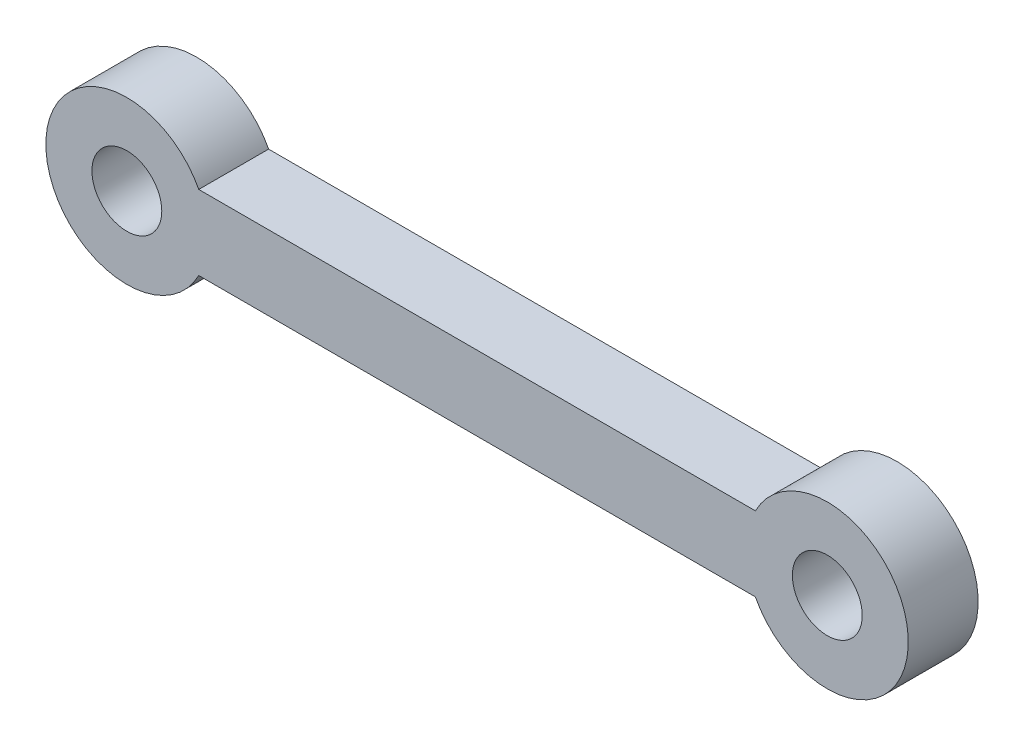
ISO-10303-21;
HEADER;
FILE_DESCRIPTION(('STEP AP214'),'2;1');
FILE_NAME('part.step','',(''),(''),'','','');
FILE_SCHEMA(('AUTOMOTIVE_DESIGN { 1 0 10303 214 1 1 1 1 }'));
ENDSEC;
DATA;
#1=APPLICATION_CONTEXT('core data for automotive mechanical design processes');
#2=APPLICATION_PROTOCOL_DEFINITION('international standard','automotive_design',2000,#1);
#3=PRODUCT_CONTEXT('',#1,'mechanical');
#4=PRODUCT('Part','Part','',(#3));
#5=PRODUCT_RELATED_PRODUCT_CATEGORY('part','',(#4));
#6=PRODUCT_DEFINITION_FORMATION('','',#4);
#7=PRODUCT_DEFINITION_CONTEXT('part definition',#1,'design');
#8=PRODUCT_DEFINITION('design','',#6,#7);
#9=PRODUCT_DEFINITION_SHAPE('','',#8);
#10=(LENGTH_UNIT() NAMED_UNIT(*) SI_UNIT(.MILLI.,.METRE.));
#11=(NAMED_UNIT(*) PLANE_ANGLE_UNIT() SI_UNIT($,.RADIAN.));
#12=(NAMED_UNIT(*) SI_UNIT($,.STERADIAN.) SOLID_ANGLE_UNIT());
#13=UNCERTAINTY_MEASURE_WITH_UNIT(LENGTH_MEASURE(1.E-05),#10,'distance_accuracy_value','');
#14=(GEOMETRIC_REPRESENTATION_CONTEXT(3) GLOBAL_UNCERTAINTY_ASSIGNED_CONTEXT((#13)) GLOBAL_UNIT_ASSIGNED_CONTEXT((#10,
#11,#12)) REPRESENTATION_CONTEXT('',''));
#15=CARTESIAN_POINT('',(0.,0.,0.));
#16=DIRECTION('',(0.,0.,1.));
#17=DIRECTION('',(1.,0.,0.));
#18=AXIS2_PLACEMENT_3D('',#15,#16,#17);
#19=CARTESIAN_POINT('',(0.,0.,3.));
#20=DIRECTION('',(0.,0.,1.));
#21=DIRECTION('',(1.,0.,0.));
#22=AXIS2_PLACEMENT_3D('',#19,#20,#21);
#23=PLANE('',#22);
#24=CARTESIAN_POINT('',(0.,0.,3.));
#25=DIRECTION('',(0.,0.,1.));
#26=DIRECTION('',(1.,0.,0.));
#27=AXIS2_PLACEMENT_3D('',#24,#25,#26);
#28=CIRCLE('',#27,1.5);
#29=CARTESIAN_POINT('',(1.5,0.,3.));
#30=VERTEX_POINT('',#29);
#31=EDGE_CURVE('E104',#30,#30,#28,.T.);
#32=ORIENTED_EDGE('',*,*,#31,.F.);
#33=EDGE_LOOP('',(#32));
#34=FACE_BOUND('',#33,.T.);
#35=CARTESIAN_POINT('',(0.,0.,3.));
#36=DIRECTION('',(0.,0.,1.));
#37=DIRECTION('',(1.,0.,0.));
#38=AXIS2_PLACEMENT_3D('',#35,#36,#37);
#39=CIRCLE('',#38,3.47734562429255);
#40=CARTESIAN_POINT('',(3.08738280600034,1.6,3.));
#41=VERTEX_POINT('',#40);
#42=CARTESIAN_POINT('',(3.08738280600034,-1.6,3.));
#43=VERTEX_POINT('',#42);
#44=EDGE_CURVE('E89',#41,#43,#39,.T.);
#45=ORIENTED_EDGE('',*,*,#44,.T.);
#46=DIRECTION('',(1.,0.,0.));
#47=VECTOR('',#46,1.);
#48=CARTESIAN_POINT('',(3.08738280600034,-1.6,3.));
#49=LINE('',#48,#47);
#50=CARTESIAN_POINT('',(26.9873828060003,-1.6,3.));
#51=VERTEX_POINT('',#50);
#52=EDGE_CURVE('E84',#43,#51,#49,.T.);
#53=ORIENTED_EDGE('',*,*,#52,.T.);
#54=CARTESIAN_POINT('',(30.0747656120007,0.,3.));
#55=DIRECTION('',(0.,0.,1.));
#56=DIRECTION('',(-1.,0.,0.));
#57=AXIS2_PLACEMENT_3D('',#54,#55,#56);
#58=CIRCLE('',#57,3.47734562429255);
#59=CARTESIAN_POINT('',(26.9873828060003,1.6,3.));
#60=VERTEX_POINT('',#59);
#61=EDGE_CURVE('E87',#51,#60,#58,.T.);
#62=ORIENTED_EDGE('',*,*,#61,.T.);
#63=DIRECTION('',(-1.,0.,0.));
#64=VECTOR('',#63,1.);
#65=CARTESIAN_POINT('',(3.08738280600034,1.6,3.));
#66=LINE('',#65,#64);
#67=EDGE_CURVE('E54',#60,#41,#66,.T.);
#68=ORIENTED_EDGE('',*,*,#67,.T.);
#69=EDGE_LOOP('',(#45,#53,#62,#68));
#70=FACE_BOUND('',#69,.T.);
#71=CARTESIAN_POINT('',(30.0747656120007,0.,3.));
#72=DIRECTION('',(0.,0.,1.));
#73=DIRECTION('',(1.,0.,0.));
#74=AXIS2_PLACEMENT_3D('',#71,#72,#73);
#75=CIRCLE('',#74,1.5);
#76=CARTESIAN_POINT('',(31.5747656120007,0.,3.));
#77=VERTEX_POINT('',#76);
#78=EDGE_CURVE('E119',#77,#77,#75,.T.);
#79=ORIENTED_EDGE('',*,*,#78,.F.);
#80=EDGE_LOOP('',(#79));
#81=FACE_BOUND('',#80,.T.);
#82=ADVANCED_FACE('F37',(#34,#70,#81),#23,.T.);
#83=CARTESIAN_POINT('',(0.,0.,0.));
#84=DIRECTION('',(0.,0.,1.));
#85=DIRECTION('',(1.,0.,0.));
#86=AXIS2_PLACEMENT_3D('',#83,#84,#85);
#87=PLANE('',#86);
#88=CARTESIAN_POINT('',(0.,0.,0.));
#89=DIRECTION('',(0.,0.,1.));
#90=DIRECTION('',(1.,0.,0.));
#91=AXIS2_PLACEMENT_3D('',#88,#89,#90);
#92=CIRCLE('',#91,3.47734562429255);
#93=CARTESIAN_POINT('',(3.08738280600034,1.6,0.));
#94=VERTEX_POINT('',#93);
#95=CARTESIAN_POINT('',(3.08738280600034,-1.6,0.));
#96=VERTEX_POINT('',#95);
#97=EDGE_CURVE('E101',#94,#96,#92,.T.);
#98=ORIENTED_EDGE('',*,*,#97,.F.);
#99=DIRECTION('',(-1.,0.,0.));
#100=VECTOR('',#99,1.);
#101=CARTESIAN_POINT('',(3.08738280600034,1.6,0.));
#102=LINE('',#101,#100);
#103=CARTESIAN_POINT('',(26.9873828060003,1.6,0.));
#104=VERTEX_POINT('',#103);
#105=EDGE_CURVE('E77',#104,#94,#102,.T.);
#106=ORIENTED_EDGE('',*,*,#105,.F.);
#107=CARTESIAN_POINT('',(30.0747656120007,0.,0.));
#108=DIRECTION('',(0.,0.,1.));
#109=DIRECTION('',(-1.,0.,0.));
#110=AXIS2_PLACEMENT_3D('',#107,#108,#109);
#111=CIRCLE('',#110,3.47734562429255);
#112=CARTESIAN_POINT('',(26.9873828060003,-1.6,0.));
#113=VERTEX_POINT('',#112);
#114=EDGE_CURVE('E71',#113,#104,#111,.T.);
#115=ORIENTED_EDGE('',*,*,#114,.F.);
#116=DIRECTION('',(1.,0.,0.));
#117=VECTOR('',#116,1.);
#118=CARTESIAN_POINT('',(3.08738280600034,-1.6,0.));
#119=LINE('',#118,#117);
#120=EDGE_CURVE('E93',#96,#113,#119,.T.);
#121=ORIENTED_EDGE('',*,*,#120,.F.);
#122=EDGE_LOOP('',(#98,#106,#115,#121));
#123=FACE_BOUND('',#122,.T.);
#124=CARTESIAN_POINT('',(0.,0.,0.));
#125=DIRECTION('',(0.,0.,1.));
#126=DIRECTION('',(1.,0.,0.));
#127=AXIS2_PLACEMENT_3D('',#124,#125,#126);
#128=CIRCLE('',#127,1.5);
#129=CARTESIAN_POINT('',(1.5,0.,0.));
#130=VERTEX_POINT('',#129);
#131=EDGE_CURVE('E116',#130,#130,#128,.T.);
#132=ORIENTED_EDGE('',*,*,#131,.T.);
#133=EDGE_LOOP('',(#132));
#134=FACE_BOUND('',#133,.T.);
#135=CARTESIAN_POINT('',(30.0747656120007,0.,0.));
#136=DIRECTION('',(0.,0.,1.));
#137=DIRECTION('',(1.,0.,0.));
#138=AXIS2_PLACEMENT_3D('',#135,#136,#137);
#139=CIRCLE('',#138,1.5);
#140=CARTESIAN_POINT('',(31.5747656120007,0.,0.));
#141=VERTEX_POINT('',#140);
#142=EDGE_CURVE('E122',#141,#141,#139,.T.);
#143=ORIENTED_EDGE('',*,*,#142,.T.);
#144=EDGE_LOOP('',(#143));
#145=FACE_BOUND('',#144,.T.);
#146=ADVANCED_FACE('F112',(#123,#134,#145),#87,.F.);
#147=CARTESIAN_POINT('',(0.,0.,3.));
#148=DIRECTION('',(0.,0.,-1.));
#149=DIRECTION('',(-1.,0.,0.));
#150=AXIS2_PLACEMENT_3D('',#147,#148,#149);
#151=CYLINDRICAL_SURFACE('',#150,3.47734562429255);
#152=ORIENTED_EDGE('',*,*,#97,.T.);
#153=DIRECTION('',(0.,0.,-1.));
#154=VECTOR('',#153,1.);
#155=CARTESIAN_POINT('',(3.08738280600034,-1.6,3.));
#156=LINE('',#155,#154);
#157=EDGE_CURVE('E11',#43,#96,#156,.T.);
#158=ORIENTED_EDGE('',*,*,#157,.F.);
#159=ORIENTED_EDGE('',*,*,#44,.F.);
#160=DIRECTION('',(0.,0.,-1.));
#161=VECTOR('',#160,1.);
#162=CARTESIAN_POINT('',(3.08738280600034,1.6,3.));
#163=LINE('',#162,#161);
#164=EDGE_CURVE('E97',#41,#94,#163,.T.);
#165=ORIENTED_EDGE('',*,*,#164,.T.);
#166=EDGE_LOOP('',(#152,#158,#159,#165));
#167=FACE_BOUND('',#166,.T.);
#168=ADVANCED_FACE('F39',(#167),#151,.T.);
#169=CARTESIAN_POINT('',(3.08738280600034,-1.6,3.));
#170=DIRECTION('',(0.,1.,0.));
#171=DIRECTION('',(0.,0.,1.));
#172=AXIS2_PLACEMENT_3D('',#169,#170,#171);
#173=PLANE('',#172);
#174=ORIENTED_EDGE('',*,*,#120,.T.);
#175=DIRECTION('',(0.,0.,-1.));
#176=VECTOR('',#175,1.);
#177=CARTESIAN_POINT('',(26.9873828060003,-1.6,3.));
#178=LINE('',#177,#176);
#179=EDGE_CURVE('E46',#51,#113,#178,.T.);
#180=ORIENTED_EDGE('',*,*,#179,.F.);
#181=ORIENTED_EDGE('',*,*,#52,.F.);
#182=ORIENTED_EDGE('',*,*,#157,.T.);
#183=EDGE_LOOP('',(#174,#180,#181,#182));
#184=FACE_BOUND('',#183,.T.);
#185=ADVANCED_FACE('F92',(#184),#173,.F.);
#186=CARTESIAN_POINT('',(30.0747656120007,0.,3.));
#187=DIRECTION('',(0.,0.,-1.));
#188=DIRECTION('',(-1.,0.,0.));
#189=AXIS2_PLACEMENT_3D('',#186,#187,#188);
#190=CYLINDRICAL_SURFACE('',#189,3.47734562429255);
#191=ORIENTED_EDGE('',*,*,#114,.T.);
#192=DIRECTION('',(0.,0.,-1.));
#193=VECTOR('',#192,1.);
#194=CARTESIAN_POINT('',(26.9873828060003,1.6,3.));
#195=LINE('',#194,#193);
#196=EDGE_CURVE('E94',#60,#104,#195,.T.);
#197=ORIENTED_EDGE('',*,*,#196,.F.);
#198=ORIENTED_EDGE('',*,*,#61,.F.);
#199=ORIENTED_EDGE('',*,*,#179,.T.);
#200=EDGE_LOOP('',(#191,#197,#198,#199));
#201=FACE_BOUND('',#200,.T.);
#202=ADVANCED_FACE('F95',(#201),#190,.T.);
#203=CARTESIAN_POINT('',(3.08738280600034,1.6,3.));
#204=DIRECTION('',(0.,-1.,0.));
#205=DIRECTION('',(0.,0.,-1.));
#206=AXIS2_PLACEMENT_3D('',#203,#204,#205);
#207=PLANE('',#206);
#208=ORIENTED_EDGE('',*,*,#105,.T.);
#209=ORIENTED_EDGE('',*,*,#164,.F.);
#210=ORIENTED_EDGE('',*,*,#67,.F.);
#211=ORIENTED_EDGE('',*,*,#196,.T.);
#212=EDGE_LOOP('',(#208,#209,#210,#211));
#213=FACE_BOUND('',#212,.T.);
#214=ADVANCED_FACE('F109',(#213),#207,.F.);
#215=CARTESIAN_POINT('',(0.,0.,3.));
#216=DIRECTION('',(0.,0.,-1.));
#217=DIRECTION('',(-1.,0.,0.));
#218=AXIS2_PLACEMENT_3D('',#215,#216,#217);
#219=CYLINDRICAL_SURFACE('',#218,1.5);
#220=ORIENTED_EDGE('',*,*,#31,.T.);
#221=EDGE_LOOP('',(#220));
#222=FACE_BOUND('',#221,.T.);
#223=ORIENTED_EDGE('',*,*,#131,.F.);
#224=EDGE_LOOP('',(#223));
#225=FACE_BOUND('',#224,.T.);
#226=ADVANCED_FACE('F139',(#222,#225),#219,.F.);
#227=CARTESIAN_POINT('',(30.0747656120007,0.,3.));
#228=DIRECTION('',(0.,0.,-1.));
#229=DIRECTION('',(-1.,0.,0.));
#230=AXIS2_PLACEMENT_3D('',#227,#228,#229);
#231=CYLINDRICAL_SURFACE('',#230,1.5);
#232=ORIENTED_EDGE('',*,*,#78,.T.);
#233=EDGE_LOOP('',(#232));
#234=FACE_BOUND('',#233,.T.);
#235=ORIENTED_EDGE('',*,*,#142,.F.);
#236=EDGE_LOOP('',(#235));
#237=FACE_BOUND('',#236,.T.);
#238=ADVANCED_FACE('F128',(#234,#237),#231,.F.);
#239=CLOSED_SHELL('',(#82,#146,#168,#185,#202,#214,#226,#238));
#240=MANIFOLD_SOLID_BREP('B2',#239);
#241=ADVANCED_BREP_SHAPE_REPRESENTATION('',(#18,#240),#14);
#242=SHAPE_DEFINITION_REPRESENTATION(#9,#241);
ENDSEC;
END-ISO-10303-21;
